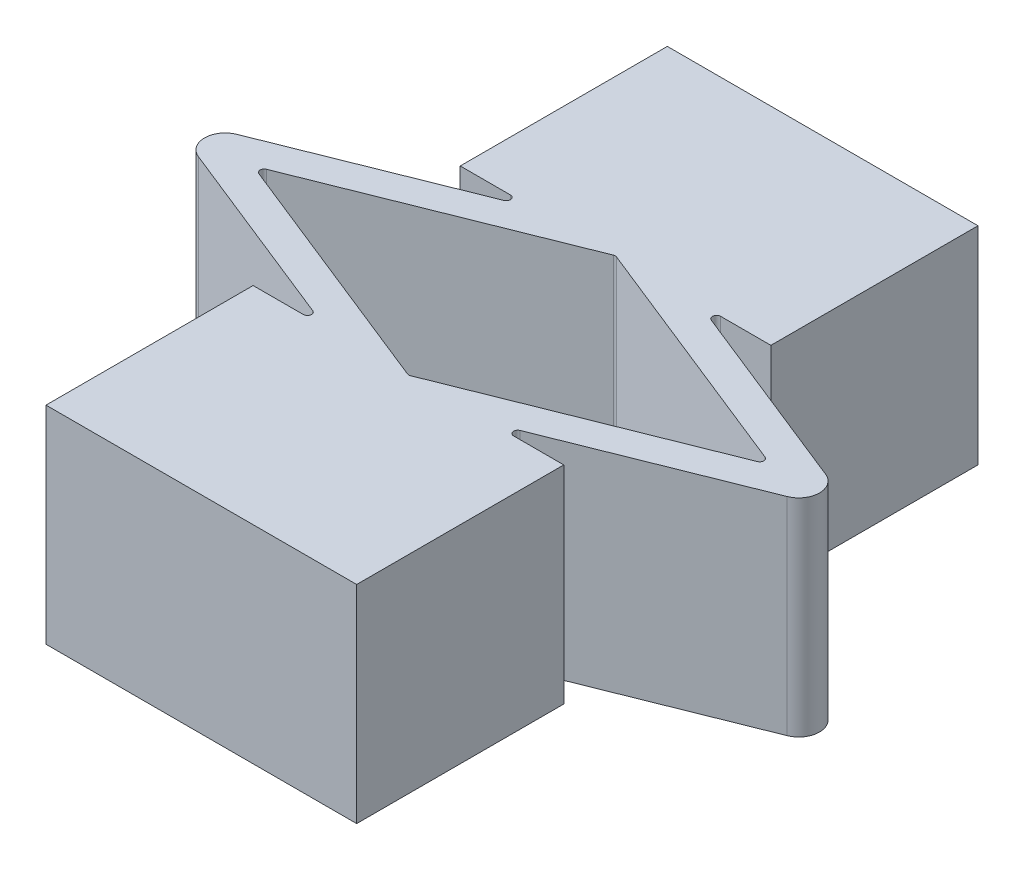
ISO-10303-21;
HEADER;
FILE_DESCRIPTION(('STEP AP214'),'2;1');
FILE_NAME('part.step','',(''),(''),'','','');
FILE_SCHEMA(('AUTOMOTIVE_DESIGN { 1 0 10303 214 1 1 1 1 }'));
ENDSEC;
DATA;
#1=APPLICATION_CONTEXT('core data for automotive mechanical design processes');
#2=APPLICATION_PROTOCOL_DEFINITION('international standard','automotive_design',2000,#1);
#3=PRODUCT_CONTEXT('',#1,'mechanical');
#4=PRODUCT('Part','Part','',(#3));
#5=PRODUCT_RELATED_PRODUCT_CATEGORY('part','',(#4));
#6=PRODUCT_DEFINITION_FORMATION('','',#4);
#7=PRODUCT_DEFINITION_CONTEXT('part definition',#1,'design');
#8=PRODUCT_DEFINITION('design','',#6,#7);
#9=PRODUCT_DEFINITION_SHAPE('','',#8);
#10=(LENGTH_UNIT() NAMED_UNIT(*) SI_UNIT(.MILLI.,.METRE.));
#11=(NAMED_UNIT(*) PLANE_ANGLE_UNIT() SI_UNIT($,.RADIAN.));
#12=(NAMED_UNIT(*) SI_UNIT($,.STERADIAN.) SOLID_ANGLE_UNIT());
#13=UNCERTAINTY_MEASURE_WITH_UNIT(LENGTH_MEASURE(1.E-05),#10,'distance_accuracy_value','');
#14=(GEOMETRIC_REPRESENTATION_CONTEXT(3) GLOBAL_UNCERTAINTY_ASSIGNED_CONTEXT((#13)) GLOBAL_UNIT_ASSIGNED_CONTEXT((#10,
#11,#12)) REPRESENTATION_CONTEXT('',''));
#15=CARTESIAN_POINT('',(0.,0.,0.));
#16=DIRECTION('',(0.,0.,1.));
#17=DIRECTION('',(1.,0.,0.));
#18=AXIS2_PLACEMENT_3D('',#15,#16,#17);
#19=CARTESIAN_POINT('',(0.,10.,-15.));
#20=DIRECTION('',(0.,0.,-1.));
#21=DIRECTION('',(-1.,0.,0.));
#22=AXIS2_PLACEMENT_3D('',#19,#20,#21);
#23=PLANE('',#22);
#24=DIRECTION('',(1.,0.,0.));
#25=VECTOR('',#24,1.);
#26=CARTESIAN_POINT('',(0.,0.,-15.));
#27=LINE('',#26,#25);
#28=CARTESIAN_POINT('',(-7.5,0.,-15.));
#29=VERTEX_POINT('',#28);
#30=CARTESIAN_POINT('',(-5.07739008606432,0.,-15.));
#31=VERTEX_POINT('',#30);
#32=EDGE_CURVE('E312',#29,#31,#27,.T.);
#33=ORIENTED_EDGE('',*,*,#32,.T.);
#34=DIRECTION('',(0.,-1.,0.));
#35=VECTOR('',#34,1.);
#36=CARTESIAN_POINT('',(-5.07739008606432,10.,-15.));
#37=LINE('',#36,#35);
#38=CARTESIAN_POINT('',(-5.07739008606432,10.,-15.));
#39=VERTEX_POINT('',#38);
#40=EDGE_CURVE('E358',#31,#39,#37,.F.);
#41=ORIENTED_EDGE('',*,*,#40,.T.);
#42=DIRECTION('',(1.,0.,0.));
#43=VECTOR('',#42,1.);
#44=CARTESIAN_POINT('',(0.,10.,-15.));
#45=LINE('',#44,#43);
#46=CARTESIAN_POINT('',(-7.5,10.,-15.));
#47=VERTEX_POINT('',#46);
#48=EDGE_CURVE('E295',#47,#39,#45,.T.);
#49=ORIENTED_EDGE('',*,*,#48,.F.);
#50=DIRECTION('',(0.,-1.,0.));
#51=VECTOR('',#50,1.);
#52=CARTESIAN_POINT('',(-7.5,10.,-15.));
#53=LINE('',#52,#51);
#54=EDGE_CURVE('E311',#47,#29,#53,.T.);
#55=ORIENTED_EDGE('',*,*,#54,.T.);
#56=EDGE_LOOP('',(#33,#41,#49,#55));
#57=FACE_BOUND('',#56,.T.);
#58=ADVANCED_FACE('F43',(#57),#23,.F.);
#59=CARTESIAN_POINT('',(5.07739008606433,10.,-15.));
#60=VERTEX_POINT('',#59);
#61=CARTESIAN_POINT('',(7.5,10.,-15.));
#62=VERTEX_POINT('',#61);
#63=EDGE_CURVE('E300',#60,#62,#45,.T.);
#64=ORIENTED_EDGE('',*,*,#63,.F.);
#65=DIRECTION('',(0.,-1.,0.));
#66=VECTOR('',#65,1.);
#67=CARTESIAN_POINT('',(5.07739008606433,10.,-15.));
#68=LINE('',#67,#66);
#69=CARTESIAN_POINT('',(5.07739008606433,0.,-15.));
#70=VERTEX_POINT('',#69);
#71=EDGE_CURVE('E347',#60,#70,#68,.T.);
#72=ORIENTED_EDGE('',*,*,#71,.T.);
#73=CARTESIAN_POINT('',(7.5,0.,-15.));
#74=VERTEX_POINT('',#73);
#75=EDGE_CURVE('E284',#70,#74,#27,.T.);
#76=ORIENTED_EDGE('',*,*,#75,.T.);
#77=DIRECTION('',(0.,-1.,0.));
#78=VECTOR('',#77,1.);
#79=CARTESIAN_POINT('',(7.5,10.,-15.));
#80=LINE('',#79,#78);
#81=EDGE_CURVE('E336',#62,#74,#80,.T.);
#82=ORIENTED_EDGE('',*,*,#81,.F.);
#83=EDGE_LOOP('',(#64,#72,#76,#82));
#84=FACE_BOUND('',#83,.T.);
#85=ADVANCED_FACE('F604',(#84),#23,.F.);
#86=CARTESIAN_POINT('',(7.5,10.,0.));
#87=DIRECTION('',(-1.,0.,0.));
#88=DIRECTION('',(0.,0.,1.));
#89=AXIS2_PLACEMENT_3D('',#86,#87,#88);
#90=PLANE('',#89);
#91=DIRECTION('',(0.,0.,-1.));
#92=VECTOR('',#91,1.);
#93=CARTESIAN_POINT('',(7.5,0.,0.));
#94=LINE('',#93,#92);
#95=CARTESIAN_POINT('',(7.5,0.,-25.));
#96=VERTEX_POINT('',#95);
#97=EDGE_CURVE('E316',#74,#96,#94,.T.);
#98=ORIENTED_EDGE('',*,*,#97,.T.);
#99=DIRECTION('',(0.,-1.,0.));
#100=VECTOR('',#99,1.);
#101=CARTESIAN_POINT('',(7.5,10.,-25.));
#102=LINE('',#101,#100);
#103=CARTESIAN_POINT('',(7.5,10.,-25.));
#104=VERTEX_POINT('',#103);
#105=EDGE_CURVE('E333',#104,#96,#102,.T.);
#106=ORIENTED_EDGE('',*,*,#105,.F.);
#107=DIRECTION('',(0.,0.,-1.));
#108=VECTOR('',#107,1.);
#109=CARTESIAN_POINT('',(7.5,10.,0.));
#110=LINE('',#109,#108);
#111=EDGE_CURVE('E299',#62,#104,#110,.T.);
#112=ORIENTED_EDGE('',*,*,#111,.F.);
#113=ORIENTED_EDGE('',*,*,#81,.T.);
#114=EDGE_LOOP('',(#98,#106,#112,#113));
#115=FACE_BOUND('',#114,.T.);
#116=ADVANCED_FACE('F610',(#115),#90,.F.);
#117=CARTESIAN_POINT('',(0.,10.,-25.));
#118=DIRECTION('',(0.,0.,-1.));
#119=DIRECTION('',(-1.,0.,0.));
#120=AXIS2_PLACEMENT_3D('',#117,#118,#119);
#121=PLANE('',#120);
#122=DIRECTION('',(1.,0.,0.));
#123=VECTOR('',#122,1.);
#124=CARTESIAN_POINT('',(0.,0.,-25.));
#125=LINE('',#124,#123);
#126=CARTESIAN_POINT('',(-7.5,0.,-25.));
#127=VERTEX_POINT('',#126);
#128=EDGE_CURVE('E320',#127,#96,#125,.T.);
#129=ORIENTED_EDGE('',*,*,#128,.F.);
#130=DIRECTION('',(0.,-1.,0.));
#131=VECTOR('',#130,1.);
#132=CARTESIAN_POINT('',(-7.5,10.,-25.));
#133=LINE('',#132,#131);
#134=CARTESIAN_POINT('',(-7.5,10.,-25.));
#135=VERTEX_POINT('',#134);
#136=EDGE_CURVE('E330',#135,#127,#133,.T.);
#137=ORIENTED_EDGE('',*,*,#136,.F.);
#138=DIRECTION('',(1.,0.,0.));
#139=VECTOR('',#138,1.);
#140=CARTESIAN_POINT('',(0.,10.,-25.));
#141=LINE('',#140,#139);
#142=EDGE_CURVE('E303',#135,#104,#141,.T.);
#143=ORIENTED_EDGE('',*,*,#142,.T.);
#144=ORIENTED_EDGE('',*,*,#105,.T.);
#145=EDGE_LOOP('',(#129,#137,#143,#144));
#146=FACE_BOUND('',#145,.T.);
#147=ADVANCED_FACE('F656',(#146),#121,.T.);
#148=CARTESIAN_POINT('',(-7.5,10.,0.));
#149=DIRECTION('',(-1.,0.,0.));
#150=DIRECTION('',(0.,0.,1.));
#151=AXIS2_PLACEMENT_3D('',#148,#149,#150);
#152=PLANE('',#151);
#153=DIRECTION('',(0.,0.,-1.));
#154=VECTOR('',#153,1.);
#155=CARTESIAN_POINT('',(-7.5,0.,0.));
#156=LINE('',#155,#154);
#157=EDGE_CURVE('E324',#29,#127,#156,.T.);
#158=ORIENTED_EDGE('',*,*,#157,.F.);
#159=ORIENTED_EDGE('',*,*,#54,.F.);
#160=DIRECTION('',(0.,0.,-1.));
#161=VECTOR('',#160,1.);
#162=CARTESIAN_POINT('',(-7.5,10.,0.));
#163=LINE('',#162,#161);
#164=EDGE_CURVE('E307',#47,#135,#163,.T.);
#165=ORIENTED_EDGE('',*,*,#164,.T.);
#166=ORIENTED_EDGE('',*,*,#136,.T.);
#167=EDGE_LOOP('',(#158,#159,#165,#166));
#168=FACE_BOUND('',#167,.T.);
#169=ADVANCED_FACE('F660',(#168),#152,.T.);
#170=CARTESIAN_POINT('',(0.,10.,0.));
#171=DIRECTION('',(0.,1.,0.));
#172=DIRECTION('',(0.,0.,1.));
#173=AXIS2_PLACEMENT_3D('',#170,#171,#172);
#174=PLANE('',#173);
#175=DIRECTION('',(-0.928476690885259,0.,0.371390676354103));
#176=VECTOR('',#175,1.);
#177=CARTESIAN_POINT('',(-1.16705191650333,10.,-2.91762979125832));
#178=LINE('',#177,#176);
#179=CARTESIAN_POINT('',(14.2176818781377,10.,-9.07152330911473));
#180=VERTEX_POINT('',#179);
#181=CARTESIAN_POINT('',(5.0031119507935,10.,-5.38569533817705));
#182=VERTEX_POINT('',#181);
#183=EDGE_CURVE('E499',#180,#182,#178,.T.);
#184=ORIENTED_EDGE('',*,*,#183,.F.);
#185=CARTESIAN_POINT('',(13.8462912017836,10.,-9.99999999999999));
#186=DIRECTION('',(0.,1.,0.));
#187=DIRECTION('',(0.,0.,1.));
#188=AXIS2_PLACEMENT_3D('',#185,#186,#187);
#189=CIRCLE('',#188,1.);
#190=CARTESIAN_POINT('',(14.2176818781377,10.,-10.9284766908853));
#191=VERTEX_POINT('',#190);
#192=EDGE_CURVE('E462',#180,#191,#189,.T.);
#193=ORIENTED_EDGE('',*,*,#192,.T.);
#194=DIRECTION('',(0.928476690885259,0.,0.371390676354104));
#195=VECTOR('',#194,1.);
#196=CARTESIAN_POINT('',(5.72949980763461,10.,-14.3237495190865));
#197=LINE('',#196,#195);
#198=CARTESIAN_POINT('',(5.00311195079351,10.,-14.6143046618229));
#199=VERTEX_POINT('',#198);
#200=EDGE_CURVE('E549',#199,#191,#197,.T.);
#201=ORIENTED_EDGE('',*,*,#200,.F.);
#202=CARTESIAN_POINT('',(5.07739008606433,10.,-14.8));
#203=DIRECTION('',(0.,1.,0.));
#204=DIRECTION('',(0.,0.,1.));
#205=AXIS2_PLACEMENT_3D('',#202,#203,#204);
#206=CIRCLE('',#205,0.2);
#207=EDGE_CURVE('E407',#199,#60,#206,.F.);
#208=ORIENTED_EDGE('',*,*,#207,.T.);
#209=ORIENTED_EDGE('',*,*,#63,.T.);
#210=ORIENTED_EDGE('',*,*,#111,.T.);
#211=ORIENTED_EDGE('',*,*,#142,.F.);
#212=ORIENTED_EDGE('',*,*,#164,.F.);
#213=ORIENTED_EDGE('',*,*,#48,.T.);
#214=CARTESIAN_POINT('',(-5.07739008606432,10.,-14.8));
#215=DIRECTION('',(0.,1.,0.));
#216=DIRECTION('',(0.,0.,1.));
#217=AXIS2_PLACEMENT_3D('',#214,#215,#216);
#218=CIRCLE('',#217,0.2);
#219=CARTESIAN_POINT('',(-5.0031119507935,10.,-14.6143046618229));
#220=VERTEX_POINT('',#219);
#221=EDGE_CURVE('E413',#39,#220,#218,.F.);
#222=ORIENTED_EDGE('',*,*,#221,.T.);
#223=DIRECTION('',(-0.928476690885259,0.,0.371390676354104));
#224=VECTOR('',#223,1.);
#225=CARTESIAN_POINT('',(-5.7294998076346,10.,-14.3237495190865));
#226=LINE('',#225,#224);
#227=CARTESIAN_POINT('',(-14.2176818781377,10.,-10.9284766908853));
#228=VERTEX_POINT('',#227);
#229=EDGE_CURVE('E270',#220,#228,#226,.T.);
#230=ORIENTED_EDGE('',*,*,#229,.T.);
#231=CARTESIAN_POINT('',(-13.8462912017836,10.,-10.));
#232=DIRECTION('',(0.,1.,0.));
#233=DIRECTION('',(0.,0.,1.));
#234=AXIS2_PLACEMENT_3D('',#231,#232,#233);
#235=CIRCLE('',#234,1.);
#236=CARTESIAN_POINT('',(-14.2176818781377,10.,-9.07152330911474));
#237=VERTEX_POINT('',#236);
#238=EDGE_CURVE('E59',#228,#237,#235,.T.);
#239=ORIENTED_EDGE('',*,*,#238,.T.);
#240=DIRECTION('',(0.928476690885259,0.,0.371390676354104));
#241=VECTOR('',#240,1.);
#242=CARTESIAN_POINT('',(1.16705191650333,10.,-2.91762979125832));
#243=LINE('',#242,#241);
#244=CARTESIAN_POINT('',(-5.0031119507935,10.,-5.38569533817705));
#245=VERTEX_POINT('',#244);
#246=EDGE_CURVE('E273',#237,#245,#243,.T.);
#247=ORIENTED_EDGE('',*,*,#246,.T.);
#248=CARTESIAN_POINT('',(-5.07739008606432,10.,-5.2));
#249=DIRECTION('',(0.,1.,0.));
#250=DIRECTION('',(0.,0.,1.));
#251=AXIS2_PLACEMENT_3D('',#248,#249,#250);
#252=CIRCLE('',#251,0.2);
#253=CARTESIAN_POINT('',(-5.07739008606432,10.,-5.));
#254=VERTEX_POINT('',#253);
#255=EDGE_CURVE('E420',#245,#254,#252,.F.);
#256=ORIENTED_EDGE('',*,*,#255,.T.);
#257=DIRECTION('',(1.,0.,0.));
#258=VECTOR('',#257,1.);
#259=CARTESIAN_POINT('',(0.,10.,-5.));
#260=LINE('',#259,#258);
#261=CARTESIAN_POINT('',(-7.5,10.,-5.));
#262=VERTEX_POINT('',#261);
#263=EDGE_CURVE('E486',#262,#254,#260,.T.);
#264=ORIENTED_EDGE('',*,*,#263,.F.);
#265=DIRECTION('',(0.,0.,-1.));
#266=VECTOR('',#265,1.);
#267=CARTESIAN_POINT('',(-7.5,10.,0.));
#268=LINE('',#267,#266);
#269=CARTESIAN_POINT('',(-7.5,10.,5.));
#270=VERTEX_POINT('',#269);
#271=EDGE_CURVE('E251',#270,#262,#268,.T.);
#272=ORIENTED_EDGE('',*,*,#271,.F.);
#273=DIRECTION('',(1.,0.,0.));
#274=VECTOR('',#273,1.);
#275=CARTESIAN_POINT('',(0.,10.,5.));
#276=LINE('',#275,#274);
#277=CARTESIAN_POINT('',(7.5,10.,5.));
#278=VERTEX_POINT('',#277);
#279=EDGE_CURVE('E242',#270,#278,#276,.T.);
#280=ORIENTED_EDGE('',*,*,#279,.T.);
#281=DIRECTION('',(0.,0.,-1.));
#282=VECTOR('',#281,1.);
#283=CARTESIAN_POINT('',(7.5,10.,0.));
#284=LINE('',#283,#282);
#285=CARTESIAN_POINT('',(7.5,10.,-5.));
#286=VERTEX_POINT('',#285);
#287=EDGE_CURVE('E230',#278,#286,#284,.T.);
#288=ORIENTED_EDGE('',*,*,#287,.T.);
#289=CARTESIAN_POINT('',(5.07739008606432,10.,-5.));
#290=VERTEX_POINT('',#289);
#291=EDGE_CURVE('E241',#290,#286,#260,.T.);
#292=ORIENTED_EDGE('',*,*,#291,.F.);
#293=CARTESIAN_POINT('',(5.07739008606432,10.,-5.2));
#294=DIRECTION('',(0.,1.,0.));
#295=DIRECTION('',(0.,0.,1.));
#296=AXIS2_PLACEMENT_3D('',#293,#294,#295);
#297=CIRCLE('',#296,0.2);
#298=EDGE_CURVE('E400',#290,#182,#297,.F.);
#299=ORIENTED_EDGE('',*,*,#298,.T.);
#300=EDGE_LOOP('',(#184,#193,#201,#208,#209,#210,#211,#212,#213,#222,#230,#239,#247,#256,#264,
#272,#280,#288,#292,#299));
#301=FACE_BOUND('',#300,.T.);
#302=DIRECTION('',(-0.928476690885259,0.,0.371390676354104));
#303=VECTOR('',#302,1.);
#304=CARTESIAN_POINT('',(-5.17241379310345,10.,-12.9310344827586));
#305=LINE('',#304,#303);
#306=CARTESIAN_POINT('',(-0.0742781352708177,10.,-14.9702887458917));
#307=VERTEX_POINT('',#306);
#308=CARTESIAN_POINT('',(-12.0357616545574,10.,-10.185695338177));
#309=VERTEX_POINT('',#308);
#310=EDGE_CURVE('E281',#307,#309,#305,.T.);
#311=ORIENTED_EDGE('',*,*,#310,.F.);
#312=CARTESIAN_POINT('',(0.,10.,-14.7845934077146));
#313=DIRECTION('',(0.,1.,0.));
#314=DIRECTION('',(0.,0.,1.));
#315=AXIS2_PLACEMENT_3D('',#312,#313,#314);
#316=CIRCLE('',#315,0.2);
#317=CARTESIAN_POINT('',(0.074278135270822,10.,-14.9702887458917));
#318=VERTEX_POINT('',#317);
#319=EDGE_CURVE('E438',#307,#318,#316,.F.);
#320=ORIENTED_EDGE('',*,*,#319,.T.);
#321=DIRECTION('',(0.928476690885259,0.,0.371390676354104));
#322=VECTOR('',#321,1.);
#323=CARTESIAN_POINT('',(5.17241379310345,10.,-12.9310344827586));
#324=LINE('',#323,#322);
#325=CARTESIAN_POINT('',(12.0357616545574,10.,-10.185695338177));
#326=VERTEX_POINT('',#325);
#327=EDGE_CURVE('E533',#318,#326,#324,.T.);
#328=ORIENTED_EDGE('',*,*,#327,.T.);
#329=CARTESIAN_POINT('',(11.9614835192866,10.,-9.99999999999999));
#330=DIRECTION('',(0.,1.,0.));
#331=DIRECTION('',(0.,0.,1.));
#332=AXIS2_PLACEMENT_3D('',#329,#330,#331);
#333=CIRCLE('',#332,0.2);
#334=CARTESIAN_POINT('',(12.0357616545574,10.,-9.81430466182294));
#335=VERTEX_POINT('',#334);
#336=EDGE_CURVE('E432',#326,#335,#333,.F.);
#337=ORIENTED_EDGE('',*,*,#336,.T.);
#338=DIRECTION('',(-0.928476690885259,0.,0.371390676354103));
#339=VECTOR('',#338,1.);
#340=CARTESIAN_POINT('',(-1.72413793103448,10.,-4.31034482758621));
#341=LINE('',#340,#339);
#342=CARTESIAN_POINT('',(0.0742781352708207,10.,-5.02971125410833));
#343=VERTEX_POINT('',#342);
#344=EDGE_CURVE('E529',#335,#343,#341,.T.);
#345=ORIENTED_EDGE('',*,*,#344,.T.);
#346=CARTESIAN_POINT('',(0.,10.,-5.21540659228538));
#347=DIRECTION('',(0.,1.,0.));
#348=DIRECTION('',(0.,0.,1.));
#349=AXIS2_PLACEMENT_3D('',#346,#347,#348);
#350=CIRCLE('',#349,0.2);
#351=CARTESIAN_POINT('',(-0.0742781352708196,10.,-5.02971125410833));
#352=VERTEX_POINT('',#351);
#353=EDGE_CURVE('E426',#343,#352,#350,.F.);
#354=ORIENTED_EDGE('',*,*,#353,.T.);
#355=DIRECTION('',(0.928476690885259,0.,0.371390676354104));
#356=VECTOR('',#355,1.);
#357=CARTESIAN_POINT('',(1.72413793103448,10.,-4.31034482758621));
#358=LINE('',#357,#356);
#359=CARTESIAN_POINT('',(-12.0357616545574,10.,-9.81430466182295));
#360=VERTEX_POINT('',#359);
#361=EDGE_CURVE('E277',#360,#352,#358,.T.);
#362=ORIENTED_EDGE('',*,*,#361,.F.);
#363=CARTESIAN_POINT('',(-11.9614835192866,10.,-10.));
#364=DIRECTION('',(0.,1.,0.));
#365=DIRECTION('',(0.,0.,1.));
#366=AXIS2_PLACEMENT_3D('',#363,#364,#365);
#367=CIRCLE('',#366,0.2);
#368=EDGE_CURVE('E444',#360,#309,#367,.F.);
#369=ORIENTED_EDGE('',*,*,#368,.T.);
#370=EDGE_LOOP('',(#311,#320,#328,#337,#345,#354,#362,#369));
#371=FACE_BOUND('',#370,.T.);
#372=ADVANCED_FACE('F247',(#301,#371),#174,.T.);
#373=CARTESIAN_POINT('',(0.,0.,0.));
#374=DIRECTION('',(0.,1.,0.));
#375=DIRECTION('',(0.,0.,1.));
#376=AXIS2_PLACEMENT_3D('',#373,#374,#375);
#377=PLANE('',#376);
#378=DIRECTION('',(0.928476690885259,0.,0.371390676354104));
#379=VECTOR('',#378,1.);
#380=CARTESIAN_POINT('',(5.72949980763461,0.,-14.3237495190865));
#381=LINE('',#380,#379);
#382=CARTESIAN_POINT('',(5.00311195079351,0.,-14.6143046618229));
#383=VERTEX_POINT('',#382);
#384=CARTESIAN_POINT('',(14.2176818781377,0.,-10.9284766908853));
#385=VERTEX_POINT('',#384);
#386=EDGE_CURVE('E537',#383,#385,#381,.T.);
#387=ORIENTED_EDGE('',*,*,#386,.T.);
#388=CARTESIAN_POINT('',(13.8462912017836,0.,-9.99999999999999));
#389=DIRECTION('',(0.,1.,0.));
#390=DIRECTION('',(0.,0.,1.));
#391=AXIS2_PLACEMENT_3D('',#388,#389,#390);
#392=CIRCLE('',#391,1.);
#393=CARTESIAN_POINT('',(14.2176818781377,0.,-9.07152330911473));
#394=VERTEX_POINT('',#393);
#395=EDGE_CURVE('E454',#385,#394,#392,.F.);
#396=ORIENTED_EDGE('',*,*,#395,.T.);
#397=DIRECTION('',(-0.928476690885259,0.,0.371390676354103));
#398=VECTOR('',#397,1.);
#399=CARTESIAN_POINT('',(-1.16705191650333,0.,-2.91762979125832));
#400=LINE('',#399,#398);
#401=CARTESIAN_POINT('',(5.0031119507935,0.,-5.38569533817705));
#402=VERTEX_POINT('',#401);
#403=EDGE_CURVE('E525',#394,#402,#400,.T.);
#404=ORIENTED_EDGE('',*,*,#403,.T.);
#405=CARTESIAN_POINT('',(5.07739008606432,0.,-5.2));
#406=DIRECTION('',(0.,1.,0.));
#407=DIRECTION('',(0.,0.,1.));
#408=AXIS2_PLACEMENT_3D('',#405,#406,#407);
#409=CIRCLE('',#408,0.2);
#410=CARTESIAN_POINT('',(5.07739008606432,0.,-5.));
#411=VERTEX_POINT('',#410);
#412=EDGE_CURVE('E397',#402,#411,#409,.T.);
#413=ORIENTED_EDGE('',*,*,#412,.T.);
#414=DIRECTION('',(1.,0.,0.));
#415=VECTOR('',#414,1.);
#416=CARTESIAN_POINT('',(0.,0.,-5.));
#417=LINE('',#416,#415);
#418=CARTESIAN_POINT('',(7.5,0.,-5.));
#419=VERTEX_POINT('',#418);
#420=EDGE_CURVE('E502',#411,#419,#417,.T.);
#421=ORIENTED_EDGE('',*,*,#420,.T.);
#422=DIRECTION('',(0.,0.,-1.));
#423=VECTOR('',#422,1.);
#424=CARTESIAN_POINT('',(7.5,0.,0.));
#425=LINE('',#424,#423);
#426=CARTESIAN_POINT('',(7.5,0.,5.));
#427=VERTEX_POINT('',#426);
#428=EDGE_CURVE('E498',#427,#419,#425,.T.);
#429=ORIENTED_EDGE('',*,*,#428,.F.);
#430=DIRECTION('',(1.,0.,0.));
#431=VECTOR('',#430,1.);
#432=CARTESIAN_POINT('',(0.,0.,5.));
#433=LINE('',#432,#431);
#434=CARTESIAN_POINT('',(-7.5,0.,5.));
#435=VERTEX_POINT('',#434);
#436=EDGE_CURVE('E258',#435,#427,#433,.T.);
#437=ORIENTED_EDGE('',*,*,#436,.F.);
#438=DIRECTION('',(0.,0.,-1.));
#439=VECTOR('',#438,1.);
#440=CARTESIAN_POINT('',(-7.5,0.,0.));
#441=LINE('',#440,#439);
#442=CARTESIAN_POINT('',(-7.5,0.,-5.));
#443=VERTEX_POINT('',#442);
#444=EDGE_CURVE('E254',#435,#443,#441,.T.);
#445=ORIENTED_EDGE('',*,*,#444,.T.);
#446=CARTESIAN_POINT('',(-5.07739008606432,0.,-5.));
#447=VERTEX_POINT('',#446);
#448=EDGE_CURVE('E480',#443,#447,#417,.T.);
#449=ORIENTED_EDGE('',*,*,#448,.T.);
#450=CARTESIAN_POINT('',(-5.07739008606432,0.,-5.2));
#451=DIRECTION('',(0.,1.,0.));
#452=DIRECTION('',(0.,0.,1.));
#453=AXIS2_PLACEMENT_3D('',#450,#451,#452);
#454=CIRCLE('',#453,0.2);
#455=CARTESIAN_POINT('',(-5.0031119507935,0.,-5.38569533817705));
#456=VERTEX_POINT('',#455);
#457=EDGE_CURVE('E416',#447,#456,#454,.T.);
#458=ORIENTED_EDGE('',*,*,#457,.T.);
#459=DIRECTION('',(0.928476690885259,0.,0.371390676354104));
#460=VECTOR('',#459,1.);
#461=CARTESIAN_POINT('',(1.16705191650333,0.,-2.91762979125832));
#462=LINE('',#461,#460);
#463=CARTESIAN_POINT('',(-14.2176818781377,0.,-9.07152330911474));
#464=VERTEX_POINT('',#463);
#465=EDGE_CURVE('E264',#464,#456,#462,.T.);
#466=ORIENTED_EDGE('',*,*,#465,.F.);
#467=CARTESIAN_POINT('',(-13.8462912017836,0.,-10.));
#468=DIRECTION('',(0.,1.,0.));
#469=DIRECTION('',(0.,0.,1.));
#470=AXIS2_PLACEMENT_3D('',#467,#468,#469);
#471=CIRCLE('',#470,1.);
#472=CARTESIAN_POINT('',(-14.2176818781377,0.,-10.9284766908853));
#473=VERTEX_POINT('',#472);
#474=EDGE_CURVE('E451',#464,#473,#471,.F.);
#475=ORIENTED_EDGE('',*,*,#474,.T.);
#476=DIRECTION('',(-0.928476690885259,0.,0.371390676354104));
#477=VECTOR('',#476,1.);
#478=CARTESIAN_POINT('',(-5.7294998076346,0.,-14.3237495190865));
#479=LINE('',#478,#477);
#480=CARTESIAN_POINT('',(-5.0031119507935,0.,-14.6143046618229));
#481=VERTEX_POINT('',#480);
#482=EDGE_CURVE('E260',#481,#473,#479,.T.);
#483=ORIENTED_EDGE('',*,*,#482,.F.);
#484=CARTESIAN_POINT('',(-5.07739008606432,0.,-14.8));
#485=DIRECTION('',(0.,1.,0.));
#486=DIRECTION('',(0.,0.,1.));
#487=AXIS2_PLACEMENT_3D('',#484,#485,#486);
#488=CIRCLE('',#487,0.2);
#489=EDGE_CURVE('E410',#481,#31,#488,.T.);
#490=ORIENTED_EDGE('',*,*,#489,.T.);
#491=ORIENTED_EDGE('',*,*,#32,.F.);
#492=ORIENTED_EDGE('',*,*,#157,.T.);
#493=ORIENTED_EDGE('',*,*,#128,.T.);
#494=ORIENTED_EDGE('',*,*,#97,.F.);
#495=ORIENTED_EDGE('',*,*,#75,.F.);
#496=CARTESIAN_POINT('',(5.07739008606433,0.,-14.8));
#497=DIRECTION('',(0.,1.,0.));
#498=DIRECTION('',(0.,0.,1.));
#499=AXIS2_PLACEMENT_3D('',#496,#497,#498);
#500=CIRCLE('',#499,0.2);
#501=EDGE_CURVE('E404',#70,#383,#500,.T.);
#502=ORIENTED_EDGE('',*,*,#501,.T.);
#503=EDGE_LOOP('',(#387,#396,#404,#413,#421,#429,#437,#445,#449,#458,#466,#475,#483,#490,#491,
#492,#493,#494,#495,#502));
#504=FACE_BOUND('',#503,.T.);
#505=DIRECTION('',(0.928476690885259,0.,0.371390676354104));
#506=VECTOR('',#505,1.);
#507=CARTESIAN_POINT('',(5.17241379310345,0.,-12.9310344827586));
#508=LINE('',#507,#506);
#509=CARTESIAN_POINT('',(0.074278135270822,0.,-14.9702887458917));
#510=VERTEX_POINT('',#509);
#511=CARTESIAN_POINT('',(12.0357616545574,0.,-10.185695338177));
#512=VERTEX_POINT('',#511);
#513=EDGE_CURVE('E540',#510,#512,#508,.T.);
#514=ORIENTED_EDGE('',*,*,#513,.F.);
#515=CARTESIAN_POINT('',(0.,0.,-14.7845934077146));
#516=DIRECTION('',(0.,1.,0.));
#517=DIRECTION('',(0.,0.,1.));
#518=AXIS2_PLACEMENT_3D('',#515,#516,#517);
#519=CIRCLE('',#518,0.2);
#520=CARTESIAN_POINT('',(-0.0742781352708177,0.,-14.9702887458917));
#521=VERTEX_POINT('',#520);
#522=EDGE_CURVE('E435',#510,#521,#519,.T.);
#523=ORIENTED_EDGE('',*,*,#522,.T.);
#524=DIRECTION('',(-0.928476690885259,0.,0.371390676354104));
#525=VECTOR('',#524,1.);
#526=CARTESIAN_POINT('',(-5.17241379310345,0.,-12.9310344827586));
#527=LINE('',#526,#525);
#528=CARTESIAN_POINT('',(-12.0357616545574,0.,-10.185695338177));
#529=VERTEX_POINT('',#528);
#530=EDGE_CURVE('E274',#521,#529,#527,.T.);
#531=ORIENTED_EDGE('',*,*,#530,.T.);
#532=CARTESIAN_POINT('',(-11.9614835192866,0.,-10.));
#533=DIRECTION('',(0.,1.,0.));
#534=DIRECTION('',(0.,0.,1.));
#535=AXIS2_PLACEMENT_3D('',#532,#533,#534);
#536=CIRCLE('',#535,0.2);
#537=CARTESIAN_POINT('',(-12.0357616545574,0.,-9.81430466182295));
#538=VERTEX_POINT('',#537);
#539=EDGE_CURVE('E441',#529,#538,#536,.T.);
#540=ORIENTED_EDGE('',*,*,#539,.T.);
#541=DIRECTION('',(0.928476690885259,0.,0.371390676354104));
#542=VECTOR('',#541,1.);
#543=CARTESIAN_POINT('',(1.72413793103448,0.,-4.31034482758621));
#544=LINE('',#543,#542);
#545=CARTESIAN_POINT('',(-0.0742781352708196,0.,-5.02971125410833));
#546=VERTEX_POINT('',#545);
#547=EDGE_CURVE('E288',#538,#546,#544,.T.);
#548=ORIENTED_EDGE('',*,*,#547,.T.);
#549=CARTESIAN_POINT('',(0.,0.,-5.21540659228538));
#550=DIRECTION('',(0.,1.,0.));
#551=DIRECTION('',(0.,0.,1.));
#552=AXIS2_PLACEMENT_3D('',#549,#550,#551);
#553=CIRCLE('',#552,0.2);
#554=CARTESIAN_POINT('',(0.0742781352708207,0.,-5.02971125410833));
#555=VERTEX_POINT('',#554);
#556=EDGE_CURVE('E423',#546,#555,#553,.T.);
#557=ORIENTED_EDGE('',*,*,#556,.T.);
#558=DIRECTION('',(-0.928476690885259,0.,0.371390676354103));
#559=VECTOR('',#558,1.);
#560=CARTESIAN_POINT('',(-1.72413793103448,0.,-4.31034482758621));
#561=LINE('',#560,#559);
#562=CARTESIAN_POINT('',(12.0357616545574,0.,-9.81430466182294));
#563=VERTEX_POINT('',#562);
#564=EDGE_CURVE('E544',#563,#555,#561,.T.);
#565=ORIENTED_EDGE('',*,*,#564,.F.);
#566=CARTESIAN_POINT('',(11.9614835192866,0.,-9.99999999999999));
#567=DIRECTION('',(0.,1.,0.));
#568=DIRECTION('',(0.,0.,1.));
#569=AXIS2_PLACEMENT_3D('',#566,#567,#568);
#570=CIRCLE('',#569,0.2);
#571=EDGE_CURVE('E429',#563,#512,#570,.T.);
#572=ORIENTED_EDGE('',*,*,#571,.T.);
#573=EDGE_LOOP('',(#514,#523,#531,#540,#548,#557,#565,#572));
#574=FACE_BOUND('',#573,.T.);
#575=ADVANCED_FACE('F473',(#504,#574),#377,.F.);
#576=CARTESIAN_POINT('',(-5.7294998076346,10.,-14.3237495190865));
#577=DIRECTION('',(0.371390676354104,0.,0.928476690885259));
#578=DIRECTION('',(0.928476690885259,0.,-0.371390676354104));
#579=AXIS2_PLACEMENT_3D('',#576,#577,#578);
#580=PLANE('',#579);
#581=ORIENTED_EDGE('',*,*,#482,.T.);
#582=DIRECTION('',(0.,-1.,0.));
#583=VECTOR('',#582,1.);
#584=CARTESIAN_POINT('',(-14.2176818781377,10.,-10.9284766908853));
#585=LINE('',#584,#583);
#586=EDGE_CURVE('E11',#473,#228,#585,.F.);
#587=ORIENTED_EDGE('',*,*,#586,.T.);
#588=ORIENTED_EDGE('',*,*,#229,.F.);
#589=DIRECTION('',(0.,-1.,0.));
#590=VECTOR('',#589,1.);
#591=CARTESIAN_POINT('',(-5.0031119507935,0.,-14.6143046618229));
#592=LINE('',#591,#590);
#593=EDGE_CURVE('E354',#220,#481,#592,.T.);
#594=ORIENTED_EDGE('',*,*,#593,.T.);
#595=EDGE_LOOP('',(#581,#587,#588,#594));
#596=FACE_BOUND('',#595,.T.);
#597=ADVANCED_FACE('F666',(#596),#580,.F.);
#598=CARTESIAN_POINT('',(1.16705191650333,10.,-2.91762979125832));
#599=DIRECTION('',(0.371390676354104,0.,-0.928476690885259));
#600=DIRECTION('',(-0.928476690885259,0.,-0.371390676354104));
#601=AXIS2_PLACEMENT_3D('',#598,#599,#600);
#602=PLANE('',#601);
#603=ORIENTED_EDGE('',*,*,#246,.F.);
#604=DIRECTION('',(0.,-1.,0.));
#605=VECTOR('',#604,1.);
#606=CARTESIAN_POINT('',(-14.2176818781377,10.,-9.07152330911474));
#607=LINE('',#606,#605);
#608=EDGE_CURVE('E52',#237,#464,#607,.T.);
#609=ORIENTED_EDGE('',*,*,#608,.T.);
#610=ORIENTED_EDGE('',*,*,#465,.T.);
#611=DIRECTION('',(0.,-1.,0.));
#612=VECTOR('',#611,1.);
#613=CARTESIAN_POINT('',(-5.0031119507935,10.,-5.38569533817705));
#614=LINE('',#613,#612);
#615=EDGE_CURVE('E365',#456,#245,#614,.F.);
#616=ORIENTED_EDGE('',*,*,#615,.T.);
#617=EDGE_LOOP('',(#603,#609,#610,#616));
#618=FACE_BOUND('',#617,.T.);
#619=ADVANCED_FACE('F469',(#618),#602,.F.);
#620=CARTESIAN_POINT('',(1.72413793103448,10.,-4.31034482758621));
#621=DIRECTION('',(0.371390676354104,0.,-0.928476690885259));
#622=DIRECTION('',(-0.928476690885259,0.,-0.371390676354104));
#623=AXIS2_PLACEMENT_3D('',#620,#621,#622);
#624=PLANE('',#623);
#625=ORIENTED_EDGE('',*,*,#361,.T.);
#626=DIRECTION('',(0.,-1.,0.));
#627=VECTOR('',#626,1.);
#628=CARTESIAN_POINT('',(-0.0742781352708198,10.,-5.02971125410833));
#629=LINE('',#628,#627);
#630=EDGE_CURVE('E372',#352,#546,#629,.T.);
#631=ORIENTED_EDGE('',*,*,#630,.T.);
#632=ORIENTED_EDGE('',*,*,#547,.F.);
#633=DIRECTION('',(0.,-1.,0.));
#634=VECTOR('',#633,1.);
#635=CARTESIAN_POINT('',(-12.0357616545574,10.,-9.81430466182295));
#636=LINE('',#635,#634);
#637=EDGE_CURVE('E369',#538,#360,#636,.F.);
#638=ORIENTED_EDGE('',*,*,#637,.T.);
#639=EDGE_LOOP('',(#625,#631,#632,#638));
#640=FACE_BOUND('',#639,.T.);
#641=ADVANCED_FACE('F580',(#640),#624,.T.);
#642=CARTESIAN_POINT('',(-5.17241379310345,10.,-12.9310344827586));
#643=DIRECTION('',(0.371390676354104,0.,0.928476690885259));
#644=DIRECTION('',(0.928476690885259,0.,-0.371390676354104));
#645=AXIS2_PLACEMENT_3D('',#642,#643,#644);
#646=PLANE('',#645);
#647=ORIENTED_EDGE('',*,*,#530,.F.);
#648=DIRECTION('',(0.,-1.,0.));
#649=VECTOR('',#648,1.);
#650=CARTESIAN_POINT('',(-0.0742781352708185,10.,-14.9702887458917));
#651=LINE('',#650,#649);
#652=EDGE_CURVE('E394',#521,#307,#651,.F.);
#653=ORIENTED_EDGE('',*,*,#652,.T.);
#654=ORIENTED_EDGE('',*,*,#310,.T.);
#655=DIRECTION('',(0.,-1.,0.));
#656=VECTOR('',#655,1.);
#657=CARTESIAN_POINT('',(-12.0357616545574,0.,-10.185695338177));
#658=LINE('',#657,#656);
#659=EDGE_CURVE('E390',#309,#529,#658,.T.);
#660=ORIENTED_EDGE('',*,*,#659,.T.);
#661=EDGE_LOOP('',(#647,#653,#654,#660));
#662=FACE_BOUND('',#661,.T.);
#663=ADVANCED_FACE('F589',(#662),#646,.T.);
#664=CARTESIAN_POINT('',(0.,10.,-5.));
#665=DIRECTION('',(0.,0.,-1.));
#666=DIRECTION('',(-1.,0.,0.));
#667=AXIS2_PLACEMENT_3D('',#664,#665,#666);
#668=PLANE('',#667);
#669=ORIENTED_EDGE('',*,*,#420,.F.);
#670=DIRECTION('',(0.,-1.,0.));
#671=VECTOR('',#670,1.);
#672=CARTESIAN_POINT('',(5.07739008606432,10.,-5.));
#673=LINE('',#672,#671);
#674=EDGE_CURVE('E344',#411,#290,#673,.F.);
#675=ORIENTED_EDGE('',*,*,#674,.T.);
#676=ORIENTED_EDGE('',*,*,#291,.T.);
#677=DIRECTION('',(0.,-1.,0.));
#678=VECTOR('',#677,1.);
#679=CARTESIAN_POINT('',(7.5,10.,-5.));
#680=LINE('',#679,#678);
#681=EDGE_CURVE('E238',#286,#419,#680,.T.);
#682=ORIENTED_EDGE('',*,*,#681,.T.);
#683=EDGE_LOOP('',(#669,#675,#676,#682));
#684=FACE_BOUND('',#683,.T.);
#685=ADVANCED_FACE('F517',(#684),#668,.T.);
#686=CARTESIAN_POINT('',(0.,10.,5.));
#687=DIRECTION('',(0.,0.,-1.));
#688=DIRECTION('',(-1.,0.,0.));
#689=AXIS2_PLACEMENT_3D('',#686,#687,#688);
#690=PLANE('',#689);
#691=ORIENTED_EDGE('',*,*,#436,.T.);
#692=DIRECTION('',(0.,-1.,0.));
#693=VECTOR('',#692,1.);
#694=CARTESIAN_POINT('',(7.5,10.,5.));
#695=LINE('',#694,#693);
#696=EDGE_CURVE('E235',#278,#427,#695,.T.);
#697=ORIENTED_EDGE('',*,*,#696,.F.);
#698=ORIENTED_EDGE('',*,*,#279,.F.);
#699=DIRECTION('',(0.,-1.,0.));
#700=VECTOR('',#699,1.);
#701=CARTESIAN_POINT('',(-7.5,10.,5.));
#702=LINE('',#701,#700);
#703=EDGE_CURVE('E493',#270,#435,#702,.T.);
#704=ORIENTED_EDGE('',*,*,#703,.T.);
#705=EDGE_LOOP('',(#691,#697,#698,#704));
#706=FACE_BOUND('',#705,.T.);
#707=ADVANCED_FACE('F256',(#706),#690,.F.);
#708=CARTESIAN_POINT('',(7.5,10.,0.));
#709=DIRECTION('',(-1.,0.,0.));
#710=DIRECTION('',(0.,0.,1.));
#711=AXIS2_PLACEMENT_3D('',#708,#709,#710);
#712=PLANE('',#711);
#713=ORIENTED_EDGE('',*,*,#428,.T.);
#714=ORIENTED_EDGE('',*,*,#681,.F.);
#715=ORIENTED_EDGE('',*,*,#287,.F.);
#716=ORIENTED_EDGE('',*,*,#696,.T.);
#717=EDGE_LOOP('',(#713,#714,#715,#716));
#718=FACE_BOUND('',#717,.T.);
#719=ADVANCED_FACE('F233',(#718),#712,.F.);
#720=ORIENTED_EDGE('',*,*,#263,.T.);
#721=DIRECTION('',(0.,-1.,0.));
#722=VECTOR('',#721,1.);
#723=CARTESIAN_POINT('',(-5.07739008606432,10.,-5.));
#724=LINE('',#723,#722);
#725=EDGE_CURVE('E361',#254,#447,#724,.T.);
#726=ORIENTED_EDGE('',*,*,#725,.T.);
#727=ORIENTED_EDGE('',*,*,#448,.F.);
#728=DIRECTION('',(0.,-1.,0.));
#729=VECTOR('',#728,1.);
#730=CARTESIAN_POINT('',(-7.5,10.,-5.));
#731=LINE('',#730,#729);
#732=EDGE_CURVE('E266',#262,#443,#731,.T.);
#733=ORIENTED_EDGE('',*,*,#732,.F.);
#734=EDGE_LOOP('',(#720,#726,#727,#733));
#735=FACE_BOUND('',#734,.T.);
#736=ADVANCED_FACE('F488',(#735),#668,.T.);
#737=CARTESIAN_POINT('',(-7.5,10.,0.));
#738=DIRECTION('',(-1.,0.,0.));
#739=DIRECTION('',(0.,0.,1.));
#740=AXIS2_PLACEMENT_3D('',#737,#738,#739);
#741=PLANE('',#740);
#742=ORIENTED_EDGE('',*,*,#444,.F.);
#743=ORIENTED_EDGE('',*,*,#703,.F.);
#744=ORIENTED_EDGE('',*,*,#271,.T.);
#745=ORIENTED_EDGE('',*,*,#732,.T.);
#746=EDGE_LOOP('',(#742,#743,#744,#745));
#747=FACE_BOUND('',#746,.T.);
#748=ADVANCED_FACE('F511',(#747),#741,.T.);
#749=CARTESIAN_POINT('',(5.72949980763461,10.,-14.3237495190865));
#750=DIRECTION('',(0.371390676354104,0.,-0.928476690885259));
#751=DIRECTION('',(-0.928476690885259,0.,-0.371390676354104));
#752=AXIS2_PLACEMENT_3D('',#749,#750,#751);
#753=PLANE('',#752);
#754=ORIENTED_EDGE('',*,*,#200,.T.);
#755=DIRECTION('',(0.,-1.,0.));
#756=VECTOR('',#755,1.);
#757=CARTESIAN_POINT('',(14.2176818781377,10.,-10.9284766908853));
#758=LINE('',#757,#756);
#759=EDGE_CURVE('E447',#191,#385,#758,.T.);
#760=ORIENTED_EDGE('',*,*,#759,.T.);
#761=ORIENTED_EDGE('',*,*,#386,.F.);
#762=DIRECTION('',(0.,-1.,0.));
#763=VECTOR('',#762,1.);
#764=CARTESIAN_POINT('',(5.00311195079351,10.,-14.6143046618229));
#765=LINE('',#764,#763);
#766=EDGE_CURVE('E351',#383,#199,#765,.F.);
#767=ORIENTED_EDGE('',*,*,#766,.T.);
#768=EDGE_LOOP('',(#754,#760,#761,#767));
#769=FACE_BOUND('',#768,.T.);
#770=ADVANCED_FACE('F595',(#769),#753,.T.);
#771=CARTESIAN_POINT('',(5.17241379310345,10.,-12.9310344827586));
#772=DIRECTION('',(0.371390676354104,0.,-0.928476690885259));
#773=DIRECTION('',(-0.928476690885259,0.,-0.371390676354104));
#774=AXIS2_PLACEMENT_3D('',#771,#772,#773);
#775=PLANE('',#774);
#776=ORIENTED_EDGE('',*,*,#513,.T.);
#777=DIRECTION('',(0.,-1.,0.));
#778=VECTOR('',#777,1.);
#779=CARTESIAN_POINT('',(12.0357616545574,10.,-10.185695338177));
#780=LINE('',#779,#778);
#781=EDGE_CURVE('E387',#512,#326,#780,.F.);
#782=ORIENTED_EDGE('',*,*,#781,.T.);
#783=ORIENTED_EDGE('',*,*,#327,.F.);
#784=DIRECTION('',(0.,-1.,0.));
#785=VECTOR('',#784,1.);
#786=CARTESIAN_POINT('',(0.0742781352708229,10.,-14.9702887458917));
#787=LINE('',#786,#785);
#788=EDGE_CURVE('E383',#318,#510,#787,.T.);
#789=ORIENTED_EDGE('',*,*,#788,.T.);
#790=EDGE_LOOP('',(#776,#782,#783,#789));
#791=FACE_BOUND('',#790,.T.);
#792=ADVANCED_FACE('F593',(#791),#775,.F.);
#793=CARTESIAN_POINT('',(-1.72413793103448,10.,-4.31034482758621));
#794=DIRECTION('',(0.371390676354103,0.,0.92847669088526));
#795=DIRECTION('',(0.92847669088526,0.,-0.371390676354103));
#796=AXIS2_PLACEMENT_3D('',#793,#794,#795);
#797=PLANE('',#796);
#798=ORIENTED_EDGE('',*,*,#564,.T.);
#799=DIRECTION('',(0.,-1.,0.));
#800=VECTOR('',#799,1.);
#801=CARTESIAN_POINT('',(0.0742781352708207,10.,-5.02971125410833));
#802=LINE('',#801,#800);
#803=EDGE_CURVE('E380',#555,#343,#802,.F.);
#804=ORIENTED_EDGE('',*,*,#803,.T.);
#805=ORIENTED_EDGE('',*,*,#344,.F.);
#806=DIRECTION('',(0.,-1.,0.));
#807=VECTOR('',#806,1.);
#808=CARTESIAN_POINT('',(12.0357616545574,0.,-9.81430466182294));
#809=LINE('',#808,#807);
#810=EDGE_CURVE('E376',#335,#563,#809,.T.);
#811=ORIENTED_EDGE('',*,*,#810,.T.);
#812=EDGE_LOOP('',(#798,#804,#805,#811));
#813=FACE_BOUND('',#812,.T.);
#814=ADVANCED_FACE('F571',(#813),#797,.F.);
#815=CARTESIAN_POINT('',(-1.16705191650333,10.,-2.91762979125832));
#816=DIRECTION('',(0.371390676354103,0.,0.92847669088526));
#817=DIRECTION('',(0.92847669088526,0.,-0.371390676354103));
#818=AXIS2_PLACEMENT_3D('',#815,#816,#817);
#819=PLANE('',#818);
#820=ORIENTED_EDGE('',*,*,#403,.F.);
#821=DIRECTION('',(0.,-1.,0.));
#822=VECTOR('',#821,1.);
#823=CARTESIAN_POINT('',(14.2176818781377,10.,-9.07152330911473));
#824=LINE('',#823,#822);
#825=EDGE_CURVE('E457',#394,#180,#824,.F.);
#826=ORIENTED_EDGE('',*,*,#825,.T.);
#827=ORIENTED_EDGE('',*,*,#183,.T.);
#828=DIRECTION('',(0.,-1.,0.));
#829=VECTOR('',#828,1.);
#830=CARTESIAN_POINT('',(5.0031119507935,0.,-5.38569533817705));
#831=LINE('',#830,#829);
#832=EDGE_CURVE('E340',#182,#402,#831,.T.);
#833=ORIENTED_EDGE('',*,*,#832,.T.);
#834=EDGE_LOOP('',(#820,#826,#827,#833));
#835=FACE_BOUND('',#834,.T.);
#836=ADVANCED_FACE('F524',(#835),#819,.T.);
#837=CARTESIAN_POINT('',(5.07739008606432,10.,-5.2));
#838=DIRECTION('',(0.,1.,0.));
#839=DIRECTION('',(0.,0.,1.));
#840=AXIS2_PLACEMENT_3D('',#837,#838,#839);
#841=CYLINDRICAL_SURFACE('',#840,0.2);
#842=ORIENTED_EDGE('',*,*,#298,.F.);
#843=ORIENTED_EDGE('',*,*,#674,.F.);
#844=ORIENTED_EDGE('',*,*,#412,.F.);
#845=ORIENTED_EDGE('',*,*,#832,.F.);
#846=EDGE_LOOP('',(#842,#843,#844,#845));
#847=FACE_BOUND('',#846,.T.);
#848=ADVANCED_FACE('F521',(#847),#841,.F.);
#849=CARTESIAN_POINT('',(5.07739008606433,10.,-14.8));
#850=DIRECTION('',(0.,-1.,0.));
#851=DIRECTION('',(0.,0.,-1.));
#852=AXIS2_PLACEMENT_3D('',#849,#850,#851);
#853=CYLINDRICAL_SURFACE('',#852,0.2);
#854=ORIENTED_EDGE('',*,*,#207,.F.);
#855=ORIENTED_EDGE('',*,*,#766,.F.);
#856=ORIENTED_EDGE('',*,*,#501,.F.);
#857=ORIENTED_EDGE('',*,*,#71,.F.);
#858=EDGE_LOOP('',(#854,#855,#856,#857));
#859=FACE_BOUND('',#858,.T.);
#860=ADVANCED_FACE('F617',(#859),#853,.F.);
#861=CARTESIAN_POINT('',(-5.07739008606432,10.,-14.8));
#862=DIRECTION('',(0.,1.,0.));
#863=DIRECTION('',(0.,0.,1.));
#864=AXIS2_PLACEMENT_3D('',#861,#862,#863);
#865=CYLINDRICAL_SURFACE('',#864,0.2);
#866=ORIENTED_EDGE('',*,*,#221,.F.);
#867=ORIENTED_EDGE('',*,*,#40,.F.);
#868=ORIENTED_EDGE('',*,*,#489,.F.);
#869=ORIENTED_EDGE('',*,*,#593,.F.);
#870=EDGE_LOOP('',(#866,#867,#868,#869));
#871=FACE_BOUND('',#870,.T.);
#872=ADVANCED_FACE('F620',(#871),#865,.F.);
#873=CARTESIAN_POINT('',(-5.07739008606432,10.,-5.2));
#874=DIRECTION('',(0.,-1.,0.));
#875=DIRECTION('',(0.,0.,-1.));
#876=AXIS2_PLACEMENT_3D('',#873,#874,#875);
#877=CYLINDRICAL_SURFACE('',#876,0.2);
#878=ORIENTED_EDGE('',*,*,#255,.F.);
#879=ORIENTED_EDGE('',*,*,#615,.F.);
#880=ORIENTED_EDGE('',*,*,#457,.F.);
#881=ORIENTED_EDGE('',*,*,#725,.F.);
#882=EDGE_LOOP('',(#878,#879,#880,#881));
#883=FACE_BOUND('',#882,.T.);
#884=ADVANCED_FACE('F484',(#883),#877,.F.);
#885=CARTESIAN_POINT('',(0.,10.,-5.21540659228538));
#886=DIRECTION('',(0.,-1.,0.));
#887=DIRECTION('',(0.,0.,-1.));
#888=AXIS2_PLACEMENT_3D('',#885,#886,#887);
#889=CYLINDRICAL_SURFACE('',#888,0.2);
#890=ORIENTED_EDGE('',*,*,#353,.F.);
#891=ORIENTED_EDGE('',*,*,#803,.F.);
#892=ORIENTED_EDGE('',*,*,#556,.F.);
#893=ORIENTED_EDGE('',*,*,#630,.F.);
#894=EDGE_LOOP('',(#890,#891,#892,#893));
#895=FACE_BOUND('',#894,.T.);
#896=ADVANCED_FACE('F578',(#895),#889,.F.);
#897=CARTESIAN_POINT('',(11.9614835192866,10.,-9.99999999999999));
#898=DIRECTION('',(0.,1.,0.));
#899=DIRECTION('',(0.,0.,1.));
#900=AXIS2_PLACEMENT_3D('',#897,#898,#899);
#901=CYLINDRICAL_SURFACE('',#900,0.2);
#902=ORIENTED_EDGE('',*,*,#336,.F.);
#903=ORIENTED_EDGE('',*,*,#781,.F.);
#904=ORIENTED_EDGE('',*,*,#571,.F.);
#905=ORIENTED_EDGE('',*,*,#810,.F.);
#906=EDGE_LOOP('',(#902,#903,#904,#905));
#907=FACE_BOUND('',#906,.T.);
#908=ADVANCED_FACE('F568',(#907),#901,.F.);
#909=CARTESIAN_POINT('',(0.,10.,-14.7845934077146));
#910=DIRECTION('',(0.,-1.,0.));
#911=DIRECTION('',(0.,0.,-1.));
#912=AXIS2_PLACEMENT_3D('',#909,#910,#911);
#913=CYLINDRICAL_SURFACE('',#912,0.2);
#914=ORIENTED_EDGE('',*,*,#319,.F.);
#915=ORIENTED_EDGE('',*,*,#652,.F.);
#916=ORIENTED_EDGE('',*,*,#522,.F.);
#917=ORIENTED_EDGE('',*,*,#788,.F.);
#918=EDGE_LOOP('',(#914,#915,#916,#917));
#919=FACE_BOUND('',#918,.T.);
#920=ADVANCED_FACE('F592',(#919),#913,.F.);
#921=CARTESIAN_POINT('',(-11.9614835192866,10.,-10.));
#922=DIRECTION('',(0.,1.,0.));
#923=DIRECTION('',(0.,0.,1.));
#924=AXIS2_PLACEMENT_3D('',#921,#922,#923);
#925=CYLINDRICAL_SURFACE('',#924,0.2);
#926=ORIENTED_EDGE('',*,*,#368,.F.);
#927=ORIENTED_EDGE('',*,*,#637,.F.);
#928=ORIENTED_EDGE('',*,*,#539,.F.);
#929=ORIENTED_EDGE('',*,*,#659,.F.);
#930=EDGE_LOOP('',(#926,#927,#928,#929));
#931=FACE_BOUND('',#930,.T.);
#932=ADVANCED_FACE('F586',(#931),#925,.F.);
#933=CARTESIAN_POINT('',(13.8462912017836,10.,-9.99999999999999));
#934=DIRECTION('',(0.,-1.,0.));
#935=DIRECTION('',(0.,0.,-1.));
#936=AXIS2_PLACEMENT_3D('',#933,#934,#935);
#937=CYLINDRICAL_SURFACE('',#936,1.);
#938=ORIENTED_EDGE('',*,*,#192,.F.);
#939=ORIENTED_EDGE('',*,*,#825,.F.);
#940=ORIENTED_EDGE('',*,*,#395,.F.);
#941=ORIENTED_EDGE('',*,*,#759,.F.);
#942=EDGE_LOOP('',(#938,#939,#940,#941));
#943=FACE_BOUND('',#942,.T.);
#944=ADVANCED_FACE('F634',(#943),#937,.T.);
#945=CARTESIAN_POINT('',(-13.8462912017836,10.,-10.));
#946=DIRECTION('',(0.,-1.,0.));
#947=DIRECTION('',(0.,0.,-1.));
#948=AXIS2_PLACEMENT_3D('',#945,#946,#947);
#949=CYLINDRICAL_SURFACE('',#948,1.);
#950=ORIENTED_EDGE('',*,*,#238,.F.);
#951=ORIENTED_EDGE('',*,*,#586,.F.);
#952=ORIENTED_EDGE('',*,*,#474,.F.);
#953=ORIENTED_EDGE('',*,*,#608,.F.);
#954=EDGE_LOOP('',(#950,#951,#952,#953));
#955=FACE_BOUND('',#954,.T.);
#956=ADVANCED_FACE('F45',(#955),#949,.T.);
#957=CLOSED_SHELL('',(#58,#85,#116,#147,#169,#372,#575,#597,#619,#641,#663,#685,#707,#719,#736,
#748,#770,#792,#814,#836,#848,#860,#872,#884,#896,#908,#920,#932,#944,#956));
#958=MANIFOLD_SOLID_BREP('B2',#957);
#959=ADVANCED_BREP_SHAPE_REPRESENTATION('',(#18,#958),#14);
#960=SHAPE_DEFINITION_REPRESENTATION(#9,#959);
ENDSEC;
END-ISO-10303-21;
